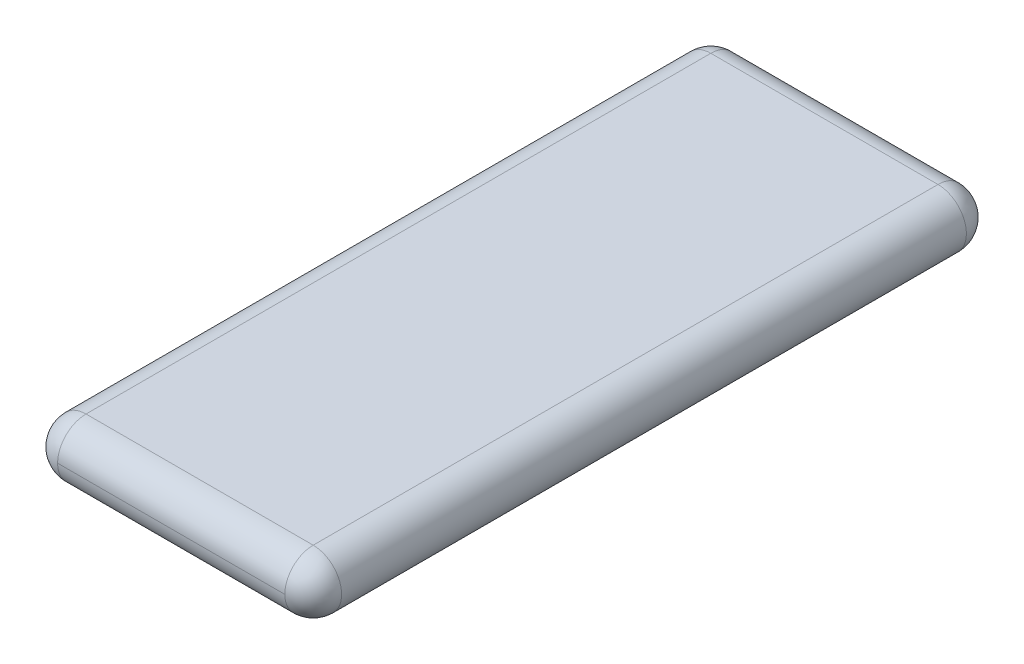
ISO-10303-21;
HEADER;
FILE_DESCRIPTION(('STEP AP214'),'2;1');
FILE_NAME('part.step','',(''),(''),'','','');
FILE_SCHEMA(('AUTOMOTIVE_DESIGN { 1 0 10303 214 1 1 1 1 }'));
ENDSEC;
DATA;
#1=APPLICATION_CONTEXT('core data for automotive mechanical design processes');
#2=APPLICATION_PROTOCOL_DEFINITION('international standard','automotive_design',2000,#1);
#3=PRODUCT_CONTEXT('',#1,'mechanical');
#4=PRODUCT('Part','Part','',(#3));
#5=PRODUCT_RELATED_PRODUCT_CATEGORY('part','',(#4));
#6=PRODUCT_DEFINITION_FORMATION('','',#4);
#7=PRODUCT_DEFINITION_CONTEXT('part definition',#1,'design');
#8=PRODUCT_DEFINITION('design','',#6,#7);
#9=PRODUCT_DEFINITION_SHAPE('','',#8);
#10=(LENGTH_UNIT() NAMED_UNIT(*) SI_UNIT(.MILLI.,.METRE.));
#11=(NAMED_UNIT(*) PLANE_ANGLE_UNIT() SI_UNIT($,.RADIAN.));
#12=(NAMED_UNIT(*) SI_UNIT($,.STERADIAN.) SOLID_ANGLE_UNIT());
#13=UNCERTAINTY_MEASURE_WITH_UNIT(LENGTH_MEASURE(1.E-05),#10,'distance_accuracy_value','');
#14=(GEOMETRIC_REPRESENTATION_CONTEXT(3) GLOBAL_UNCERTAINTY_ASSIGNED_CONTEXT((#13)) GLOBAL_UNIT_ASSIGNED_CONTEXT((#10,
#11,#12)) REPRESENTATION_CONTEXT('',''));
#15=CARTESIAN_POINT('',(0.,0.,0.));
#16=DIRECTION('',(0.,0.,1.));
#17=DIRECTION('',(1.,0.,0.));
#18=AXIS2_PLACEMENT_3D('',#15,#16,#17);
#19=CARTESIAN_POINT('',(0.,0.,120.));
#20=DIRECTION('',(0.,0.,-1.));
#21=DIRECTION('',(-1.,0.,0.));
#22=AXIS2_PLACEMENT_3D('',#19,#20,#21);
#23=CYLINDRICAL_SURFACE('',#22,5.);
#24=DIRECTION('',(0.,0.,-1.));
#25=VECTOR('',#24,1.);
#26=CARTESIAN_POINT('',(0.,5.,120.));
#27=LINE('',#26,#25);
#28=CARTESIAN_POINT('',(0.,5.,115.));
#29=VERTEX_POINT('',#28);
#30=CARTESIAN_POINT('',(0.,5.,5.));
#31=VERTEX_POINT('',#30);
#32=EDGE_CURVE('E103',#29,#31,#27,.T.);
#33=ORIENTED_EDGE('',*,*,#32,.T.);
#34=CARTESIAN_POINT('',(0.,0.,5.));
#35=DIRECTION('',(0.,0.,-1.));
#36=DIRECTION('',(-1.,0.,0.));
#37=AXIS2_PLACEMENT_3D('',#34,#35,#36);
#38=CIRCLE('',#37,5.);
#39=CARTESIAN_POINT('',(0.,-5.,5.));
#40=VERTEX_POINT('',#39);
#41=EDGE_CURVE('E11',#31,#40,#38,.F.);
#42=ORIENTED_EDGE('',*,*,#41,.T.);
#43=DIRECTION('',(0.,0.,-1.));
#44=VECTOR('',#43,1.);
#45=CARTESIAN_POINT('',(0.,-5.,120.));
#46=LINE('',#45,#44);
#47=CARTESIAN_POINT('',(0.,-5.,115.));
#48=VERTEX_POINT('',#47);
#49=EDGE_CURVE('E127',#48,#40,#46,.T.);
#50=ORIENTED_EDGE('',*,*,#49,.F.);
#51=CARTESIAN_POINT('',(0.,0.,115.));
#52=DIRECTION('',(0.,0.,-1.));
#53=DIRECTION('',(-1.,0.,0.));
#54=AXIS2_PLACEMENT_3D('',#51,#52,#53);
#55=CIRCLE('',#54,5.);
#56=EDGE_CURVE('E43',#48,#29,#55,.T.);
#57=ORIENTED_EDGE('',*,*,#56,.T.);
#58=EDGE_LOOP('',(#33,#42,#50,#57));
#59=FACE_BOUND('',#58,.T.);
#60=ADVANCED_FACE('F33',(#59),#23,.T.);
#61=CARTESIAN_POINT('',(0.,-5.,120.));
#62=DIRECTION('',(0.,1.,0.));
#63=DIRECTION('',(0.,0.,1.));
#64=AXIS2_PLACEMENT_3D('',#61,#62,#63);
#65=PLANE('',#64);
#66=ORIENTED_EDGE('',*,*,#49,.T.);
#67=DIRECTION('',(1.,0.,0.));
#68=VECTOR('',#67,1.);
#69=CARTESIAN_POINT('',(0.,-5.,5.));
#70=LINE('',#69,#68);
#71=CARTESIAN_POINT('',(40.,-5.,5.));
#72=VERTEX_POINT('',#71);
#73=EDGE_CURVE('E123',#40,#72,#70,.T.);
#74=ORIENTED_EDGE('',*,*,#73,.T.);
#75=DIRECTION('',(0.,0.,-1.));
#76=VECTOR('',#75,1.);
#77=CARTESIAN_POINT('',(40.,-5.,120.));
#78=LINE('',#77,#76);
#79=CARTESIAN_POINT('',(40.,-5.,115.));
#80=VERTEX_POINT('',#79);
#81=EDGE_CURVE('E130',#80,#72,#78,.T.);
#82=ORIENTED_EDGE('',*,*,#81,.F.);
#83=DIRECTION('',(1.,0.,0.));
#84=VECTOR('',#83,1.);
#85=CARTESIAN_POINT('',(0.,-5.,115.));
#86=LINE('',#85,#84);
#87=EDGE_CURVE('E83',#80,#48,#86,.F.);
#88=ORIENTED_EDGE('',*,*,#87,.T.);
#89=EDGE_LOOP('',(#66,#74,#82,#88));
#90=FACE_BOUND('',#89,.T.);
#91=ADVANCED_FACE('F156',(#90),#65,.F.);
#92=CARTESIAN_POINT('',(40.,0.,120.));
#93=DIRECTION('',(0.,0.,-1.));
#94=DIRECTION('',(-1.,0.,0.));
#95=AXIS2_PLACEMENT_3D('',#92,#93,#94);
#96=CYLINDRICAL_SURFACE('',#95,5.);
#97=ORIENTED_EDGE('',*,*,#81,.T.);
#98=CARTESIAN_POINT('',(40.,0.,5.));
#99=DIRECTION('',(0.,0.,-1.));
#100=DIRECTION('',(-1.,0.,0.));
#101=AXIS2_PLACEMENT_3D('',#98,#99,#100);
#102=CIRCLE('',#101,5.);
#103=CARTESIAN_POINT('',(40.,5.,5.));
#104=VERTEX_POINT('',#103);
#105=EDGE_CURVE('E119',#72,#104,#102,.F.);
#106=ORIENTED_EDGE('',*,*,#105,.T.);
#107=DIRECTION('',(0.,0.,-1.));
#108=VECTOR('',#107,1.);
#109=CARTESIAN_POINT('',(40.,5.,120.));
#110=LINE('',#109,#108);
#111=CARTESIAN_POINT('',(40.,5.,115.));
#112=VERTEX_POINT('',#111);
#113=EDGE_CURVE('E133',#112,#104,#110,.T.);
#114=ORIENTED_EDGE('',*,*,#113,.F.);
#115=CARTESIAN_POINT('',(40.,0.,115.));
#116=DIRECTION('',(0.,0.,-1.));
#117=DIRECTION('',(-1.,0.,0.));
#118=AXIS2_PLACEMENT_3D('',#115,#116,#117);
#119=CIRCLE('',#118,5.);
#120=EDGE_CURVE('E91',#112,#80,#119,.T.);
#121=ORIENTED_EDGE('',*,*,#120,.T.);
#122=EDGE_LOOP('',(#97,#106,#114,#121));
#123=FACE_BOUND('',#122,.T.);
#124=ADVANCED_FACE('F159',(#123),#96,.T.);
#125=CARTESIAN_POINT('',(0.,5.,120.));
#126=DIRECTION('',(0.,-1.,0.));
#127=DIRECTION('',(0.,0.,-1.));
#128=AXIS2_PLACEMENT_3D('',#125,#126,#127);
#129=PLANE('',#128);
#130=ORIENTED_EDGE('',*,*,#113,.T.);
#131=DIRECTION('',(-1.,0.,0.));
#132=VECTOR('',#131,1.);
#133=CARTESIAN_POINT('',(0.,5.,5.));
#134=LINE('',#133,#132);
#135=EDGE_CURVE('E52',#104,#31,#134,.T.);
#136=ORIENTED_EDGE('',*,*,#135,.T.);
#137=ORIENTED_EDGE('',*,*,#32,.F.);
#138=DIRECTION('',(-1.,0.,0.));
#139=VECTOR('',#138,1.);
#140=CARTESIAN_POINT('',(40.,5.,115.));
#141=LINE('',#140,#139);
#142=EDGE_CURVE('E117',#29,#112,#141,.F.);
#143=ORIENTED_EDGE('',*,*,#142,.T.);
#144=EDGE_LOOP('',(#130,#136,#137,#143));
#145=FACE_BOUND('',#144,.T.);
#146=ADVANCED_FACE('F189',(#145),#129,.F.);
#147=CARTESIAN_POINT('',(0.,0.,5.));
#148=DIRECTION('',(-1.,0.,0.));
#149=DIRECTION('',(0.,0.,1.));
#150=AXIS2_PLACEMENT_3D('',#147,#148,#149);
#151=CYLINDRICAL_SURFACE('',#150,5.);
#152=CARTESIAN_POINT('',(0.,0.,5.));
#153=DIRECTION('',(-1.,0.,0.));
#154=DIRECTION('',(0.,0.,1.));
#155=AXIS2_PLACEMENT_3D('',#152,#153,#154);
#156=CIRCLE('',#155,5.);
#157=CARTESIAN_POINT('',(0.,0.,0.));
#158=VERTEX_POINT('',#157);
#159=EDGE_CURVE('E101',#31,#158,#156,.T.);
#160=ORIENTED_EDGE('',*,*,#159,.F.);
#161=ORIENTED_EDGE('',*,*,#135,.F.);
#162=CARTESIAN_POINT('',(40.,0.,5.));
#163=DIRECTION('',(1.,0.,0.));
#164=DIRECTION('',(0.,0.,-1.));
#165=AXIS2_PLACEMENT_3D('',#162,#163,#164);
#166=CIRCLE('',#165,5.);
#167=CARTESIAN_POINT('',(40.,0.,0.));
#168=VERTEX_POINT('',#167);
#169=EDGE_CURVE('E104',#168,#104,#166,.T.);
#170=ORIENTED_EDGE('',*,*,#169,.F.);
#171=DIRECTION('',(-1.,0.,0.));
#172=VECTOR('',#171,1.);
#173=CARTESIAN_POINT('',(0.,0.,0.));
#174=LINE('',#173,#172);
#175=EDGE_CURVE('E107',#158,#168,#174,.F.);
#176=ORIENTED_EDGE('',*,*,#175,.F.);
#177=EDGE_LOOP('',(#160,#161,#170,#176));
#178=FACE_BOUND('',#177,.T.);
#179=ADVANCED_FACE('F142',(#178),#151,.T.);
#180=CARTESIAN_POINT('',(0.,0.,5.));
#181=DIRECTION('',(0.,0.,1.));
#182=DIRECTION('',(1.,0.,0.));
#183=AXIS2_PLACEMENT_3D('',#180,#181,#182);
#184=SPHERICAL_SURFACE('',#183,5.);
#185=ORIENTED_EDGE('',*,*,#41,.F.);
#186=ORIENTED_EDGE('',*,*,#159,.T.);
#187=CARTESIAN_POINT('',(0.,0.,5.));
#188=DIRECTION('',(1.,0.,0.));
#189=DIRECTION('',(0.,0.,-1.));
#190=AXIS2_PLACEMENT_3D('',#187,#188,#189);
#191=CIRCLE('',#190,5.);
#192=EDGE_CURVE('E110',#40,#158,#191,.T.);
#193=ORIENTED_EDGE('',*,*,#192,.F.);
#194=EDGE_LOOP('',(#185,#186,#193));
#195=FACE_BOUND('',#194,.T.);
#196=ADVANCED_FACE('F145',(#195),#184,.T.);
#197=CARTESIAN_POINT('',(40.,0.,5.));
#198=DIRECTION('',(0.,0.,1.));
#199=DIRECTION('',(1.,0.,0.));
#200=AXIS2_PLACEMENT_3D('',#197,#198,#199);
#201=SPHERICAL_SURFACE('',#200,5.);
#202=ORIENTED_EDGE('',*,*,#169,.T.);
#203=ORIENTED_EDGE('',*,*,#105,.F.);
#204=CARTESIAN_POINT('',(40.,0.,5.));
#205=DIRECTION('',(-1.,0.,0.));
#206=DIRECTION('',(0.,0.,1.));
#207=AXIS2_PLACEMENT_3D('',#204,#205,#206);
#208=CIRCLE('',#207,5.);
#209=EDGE_CURVE('E86',#168,#72,#208,.T.);
#210=ORIENTED_EDGE('',*,*,#209,.F.);
#211=EDGE_LOOP('',(#202,#203,#210));
#212=FACE_BOUND('',#211,.T.);
#213=ADVANCED_FACE('F182',(#212),#201,.T.);
#214=CARTESIAN_POINT('',(0.,0.,5.));
#215=DIRECTION('',(1.,0.,0.));
#216=DIRECTION('',(0.,0.,-1.));
#217=AXIS2_PLACEMENT_3D('',#214,#215,#216);
#218=CYLINDRICAL_SURFACE('',#217,5.);
#219=ORIENTED_EDGE('',*,*,#192,.T.);
#220=ORIENTED_EDGE('',*,*,#175,.T.);
#221=ORIENTED_EDGE('',*,*,#209,.T.);
#222=ORIENTED_EDGE('',*,*,#73,.F.);
#223=EDGE_LOOP('',(#219,#220,#221,#222));
#224=FACE_BOUND('',#223,.T.);
#225=ADVANCED_FACE('F150',(#224),#218,.T.);
#226=CARTESIAN_POINT('',(40.,0.,115.));
#227=DIRECTION('',(0.,0.,1.));
#228=DIRECTION('',(1.,0.,0.));
#229=AXIS2_PLACEMENT_3D('',#226,#227,#228);
#230=SPHERICAL_SURFACE('',#229,5.);
#231=CARTESIAN_POINT('',(40.,0.,115.));
#232=DIRECTION('',(-1.,0.,0.));
#233=DIRECTION('',(0.,0.,1.));
#234=AXIS2_PLACEMENT_3D('',#231,#232,#233);
#235=CIRCLE('',#234,5.);
#236=CARTESIAN_POINT('',(40.,0.,120.));
#237=VERTEX_POINT('',#236);
#238=EDGE_CURVE('E37',#80,#237,#235,.T.);
#239=ORIENTED_EDGE('',*,*,#238,.F.);
#240=ORIENTED_EDGE('',*,*,#120,.F.);
#241=CARTESIAN_POINT('',(40.,0.,115.));
#242=DIRECTION('',(-1.,0.,0.));
#243=DIRECTION('',(0.,0.,1.));
#244=AXIS2_PLACEMENT_3D('',#241,#242,#243);
#245=CIRCLE('',#244,5.);
#246=EDGE_CURVE('E88',#237,#112,#245,.T.);
#247=ORIENTED_EDGE('',*,*,#246,.F.);
#248=EDGE_LOOP('',(#239,#240,#247));
#249=FACE_BOUND('',#248,.T.);
#250=ADVANCED_FACE('F35',(#249),#230,.T.);
#251=CARTESIAN_POINT('',(0.,0.,115.));
#252=DIRECTION('',(-1.,0.,0.));
#253=DIRECTION('',(0.,0.,1.));
#254=AXIS2_PLACEMENT_3D('',#251,#252,#253);
#255=CYLINDRICAL_SURFACE('',#254,5.);
#256=CARTESIAN_POINT('',(0.,0.,115.));
#257=DIRECTION('',(-1.,0.,0.));
#258=DIRECTION('',(0.,0.,1.));
#259=AXIS2_PLACEMENT_3D('',#256,#257,#258);
#260=CIRCLE('',#259,5.);
#261=CARTESIAN_POINT('',(0.,0.,120.));
#262=VERTEX_POINT('',#261);
#263=EDGE_CURVE('E71',#48,#262,#260,.T.);
#264=ORIENTED_EDGE('',*,*,#263,.F.);
#265=ORIENTED_EDGE('',*,*,#87,.F.);
#266=ORIENTED_EDGE('',*,*,#238,.T.);
#267=DIRECTION('',(1.,0.,0.));
#268=VECTOR('',#267,1.);
#269=CARTESIAN_POINT('',(40.,0.,120.));
#270=LINE('',#269,#268);
#271=EDGE_CURVE('E80',#262,#237,#270,.T.);
#272=ORIENTED_EDGE('',*,*,#271,.F.);
#273=EDGE_LOOP('',(#264,#265,#266,#272));
#274=FACE_BOUND('',#273,.T.);
#275=ADVANCED_FACE('F78',(#274),#255,.T.);
#276=CARTESIAN_POINT('',(0.,0.,115.));
#277=DIRECTION('',(0.,0.,1.));
#278=DIRECTION('',(1.,0.,0.));
#279=AXIS2_PLACEMENT_3D('',#276,#277,#278);
#280=SPHERICAL_SURFACE('',#279,5.);
#281=ORIENTED_EDGE('',*,*,#56,.F.);
#282=ORIENTED_EDGE('',*,*,#263,.T.);
#283=CARTESIAN_POINT('',(0.,0.,115.));
#284=DIRECTION('',(1.,0.,0.));
#285=DIRECTION('',(0.,0.,-1.));
#286=AXIS2_PLACEMENT_3D('',#283,#284,#285);
#287=CIRCLE('',#286,5.);
#288=EDGE_CURVE('E97',#29,#262,#287,.T.);
#289=ORIENTED_EDGE('',*,*,#288,.F.);
#290=EDGE_LOOP('',(#281,#282,#289));
#291=FACE_BOUND('',#290,.T.);
#292=ADVANCED_FACE('F164',(#291),#280,.T.);
#293=CARTESIAN_POINT('',(0.,0.,115.));
#294=DIRECTION('',(1.,0.,0.));
#295=DIRECTION('',(0.,0.,-1.));
#296=AXIS2_PLACEMENT_3D('',#293,#294,#295);
#297=CYLINDRICAL_SURFACE('',#296,5.);
#298=ORIENTED_EDGE('',*,*,#246,.T.);
#299=ORIENTED_EDGE('',*,*,#142,.F.);
#300=ORIENTED_EDGE('',*,*,#288,.T.);
#301=ORIENTED_EDGE('',*,*,#271,.T.);
#302=EDGE_LOOP('',(#298,#299,#300,#301));
#303=FACE_BOUND('',#302,.T.);
#304=ADVANCED_FACE('F96',(#303),#297,.T.);
#305=CLOSED_SHELL('',(#60,#91,#124,#146,#179,#196,#213,#225,#250,#275,#292,#304));
#306=MANIFOLD_SOLID_BREP('B2',#305);
#307=ADVANCED_BREP_SHAPE_REPRESENTATION('',(#18,#306),#14);
#308=SHAPE_DEFINITION_REPRESENTATION(#9,#307);
ENDSEC;
END-ISO-10303-21;
